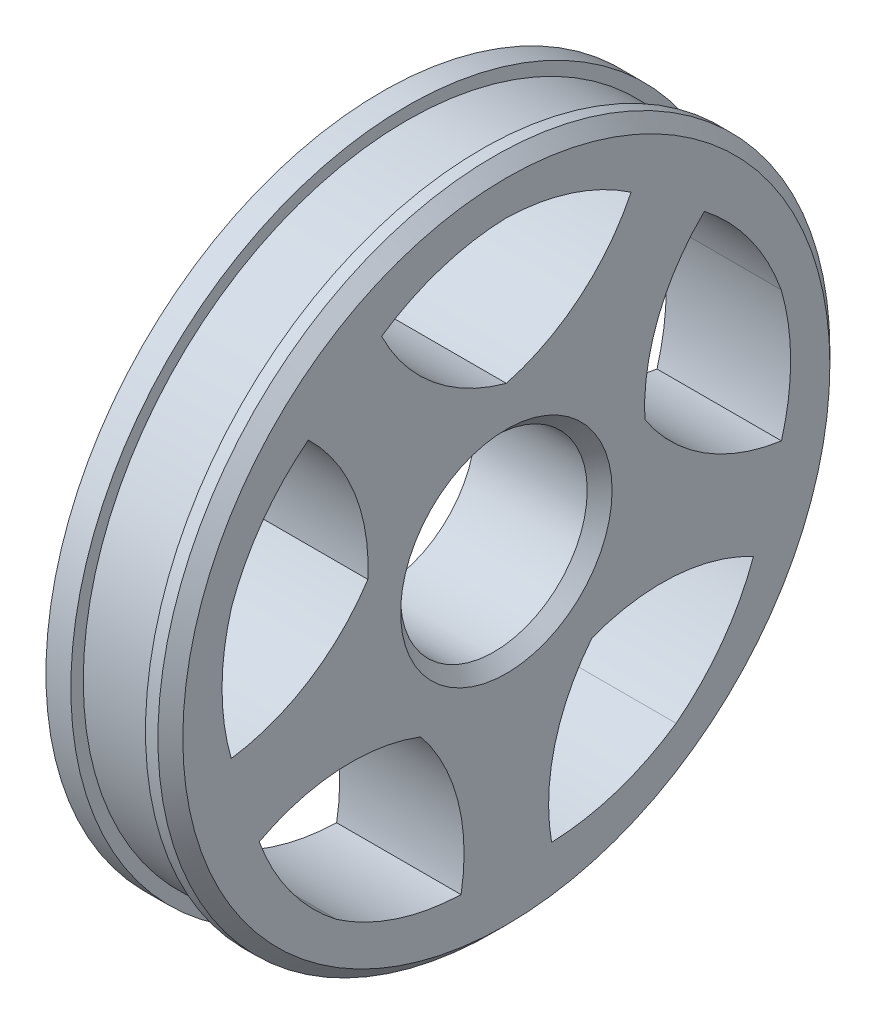
ISO-10303-21;
HEADER;
FILE_DESCRIPTION(('STEP AP214'),'2;1');
FILE_NAME('part.step','',(''),(''),'','','');
FILE_SCHEMA(('AUTOMOTIVE_DESIGN { 1 0 10303 214 1 1 1 1 }'));
ENDSEC;
DATA;
#1=APPLICATION_CONTEXT('core data for automotive mechanical design processes');
#2=APPLICATION_PROTOCOL_DEFINITION('international standard','automotive_design',2000,#1);
#3=PRODUCT_CONTEXT('',#1,'mechanical');
#4=PRODUCT('Part','Part','',(#3));
#5=PRODUCT_RELATED_PRODUCT_CATEGORY('part','',(#4));
#6=PRODUCT_DEFINITION_FORMATION('','',#4);
#7=PRODUCT_DEFINITION_CONTEXT('part definition',#1,'design');
#8=PRODUCT_DEFINITION('design','',#6,#7);
#9=PRODUCT_DEFINITION_SHAPE('','',#8);
#10=(LENGTH_UNIT() NAMED_UNIT(*) SI_UNIT(.MILLI.,.METRE.));
#11=(NAMED_UNIT(*) PLANE_ANGLE_UNIT() SI_UNIT($,.RADIAN.));
#12=(NAMED_UNIT(*) SI_UNIT($,.STERADIAN.) SOLID_ANGLE_UNIT());
#13=UNCERTAINTY_MEASURE_WITH_UNIT(LENGTH_MEASURE(1.E-05),#10,'distance_accuracy_value','');
#14=(GEOMETRIC_REPRESENTATION_CONTEXT(3) GLOBAL_UNCERTAINTY_ASSIGNED_CONTEXT((#13)) GLOBAL_UNIT_ASSIGNED_CONTEXT((#10,
#11,#12)) REPRESENTATION_CONTEXT('',''));
#15=CARTESIAN_POINT('',(0.,0.,0.));
#16=DIRECTION('',(0.,0.,1.));
#17=DIRECTION('',(1.,0.,0.));
#18=AXIS2_PLACEMENT_3D('',#15,#16,#17);
#19=CARTESIAN_POINT('',(2.5,0.,0.));
#20=DIRECTION('',(-1.,0.,0.));
#21=DIRECTION('',(0.,0.,1.));
#22=AXIS2_PLACEMENT_3D('',#19,#20,#21);
#23=CYLINDRICAL_SURFACE('',#22,13.5);
#24=CARTESIAN_POINT('',(-2.5,0.,0.));
#25=DIRECTION('',(1.,0.,0.));
#26=DIRECTION('',(0.,0.,-1.));
#27=AXIS2_PLACEMENT_3D('',#24,#25,#26);
#28=CIRCLE('',#27,13.5);
#29=CARTESIAN_POINT('',(-2.5,0.,-13.5));
#30=VERTEX_POINT('',#29);
#31=EDGE_CURVE('E339',#30,#30,#28,.T.);
#32=ORIENTED_EDGE('',*,*,#31,.T.);
#33=EDGE_LOOP('',(#32));
#34=FACE_BOUND('',#33,.T.);
#35=CARTESIAN_POINT('',(-1.5,0.,0.));
#36=DIRECTION('',(1.,0.,0.));
#37=DIRECTION('',(0.,0.,-1.));
#38=AXIS2_PLACEMENT_3D('',#35,#36,#37);
#39=CIRCLE('',#38,13.5);
#40=CARTESIAN_POINT('',(-1.5,0.,-13.5));
#41=VERTEX_POINT('',#40);
#42=EDGE_CURVE('E253',#41,#41,#39,.T.);
#43=ORIENTED_EDGE('',*,*,#42,.F.);
#44=EDGE_LOOP('',(#43));
#45=FACE_BOUND('',#44,.T.);
#46=ADVANCED_FACE('F35',(#34,#45),#23,.T.);
#47=CARTESIAN_POINT('',(2.5,0.,0.));
#48=DIRECTION('',(1.,0.,0.));
#49=DIRECTION('',(0.,0.,-1.));
#50=AXIS2_PLACEMENT_3D('',#47,#48,#49);
#51=PLANE('',#50);
#52=CARTESIAN_POINT('',(2.5,0.,0.));
#53=DIRECTION('',(1.,0.,0.));
#54=DIRECTION('',(0.,0.,-1.));
#55=AXIS2_PLACEMENT_3D('',#52,#53,#54);
#56=CIRCLE('',#55,4.25);
#57=CARTESIAN_POINT('',(2.5,0.,-4.25));
#58=VERTEX_POINT('',#57);
#59=EDGE_CURVE('E44',#58,#58,#56,.F.);
#60=ORIENTED_EDGE('',*,*,#59,.T.);
#61=EDGE_LOOP('',(#60));
#62=FACE_BOUND('',#61,.T.);
#63=CARTESIAN_POINT('',(2.5,0.,0.));
#64=DIRECTION('',(1.,0.,0.));
#65=DIRECTION('',(0.,0.,-1.));
#66=AXIS2_PLACEMENT_3D('',#63,#64,#65);
#67=CIRCLE('',#66,13.);
#68=CARTESIAN_POINT('',(2.5,0.,-13.));
#69=VERTEX_POINT('',#68);
#70=EDGE_CURVE('E345',#69,#69,#67,.T.);
#71=ORIENTED_EDGE('',*,*,#70,.T.);
#72=EDGE_LOOP('',(#71));
#73=FACE_BOUND('',#72,.T.);
#74=CARTESIAN_POINT('',(2.5,0.931815794103075,-2.02933749414677));
#75=DIRECTION('',(1.,0.,0.));
#76=DIRECTION('',(0.,-0.95105651629515,-0.309016994374958));
#77=AXIS2_PLACEMENT_3D('',#74,#75,#76);
#78=CIRCLE('',#77,9.39432433543306);
#79=CARTESIAN_POINT('',(2.5,-1.678595206542,-11.0536980879518));
#80=VERTEX_POINT('',#79);
#81=CARTESIAN_POINT('',(2.5,3.58728925984448,-11.0405410981085));
#82=VERTEX_POINT('',#81);
#83=EDGE_CURVE('E264',#80,#82,#78,.T.);
#84=ORIENTED_EDGE('',*,*,#83,.F.);
#85=CARTESIAN_POINT('',(2.5,6.08419028301145,-12.1309249973145));
#86=DIRECTION('',(1.,0.,0.));
#87=DIRECTION('',(0.,-0.95105651629515,-0.309016994374958));
#88=AXIS2_PLACEMENT_3D('',#85,#86,#87);
#89=CIRCLE('',#88,7.8371714521935);
#90=CARTESIAN_POINT('',(2.5,1.80765526838161,-5.56339086038598));
#91=VERTEX_POINT('',#90);
#92=EDGE_CURVE('E262',#91,#80,#89,.T.);
#93=ORIENTED_EDGE('',*,*,#92,.F.);
#94=CARTESIAN_POINT('',(2.5,2.2081654741207,-13.3903218008106));
#95=DIRECTION('',(1.,0.,0.));
#96=DIRECTION('',(0.,0.95105651629515,0.309016994374958));
#97=AXIS2_PLACEMENT_3D('',#94,#95,#96);
#98=CIRCLE('',#97,7.8371714521935);
#99=CARTESIAN_POINT('',(2.5,7.85521276816055,-7.95597609686846));
#100=VERTEX_POINT('',#99);
#101=EDGE_CURVE('E268',#100,#91,#98,.T.);
#102=ORIENTED_EDGE('',*,*,#101,.F.);
#103=CARTESIAN_POINT('',(2.5,0.43895983792731,-2.18947610171399));
#104=DIRECTION('',(1.,0.,0.));
#105=DIRECTION('',(0.,0.95105651629515,0.309016994374958));
#106=AXIS2_PLACEMENT_3D('',#103,#104,#105);
#107=CIRCLE('',#106,9.39432433543306);
#108=EDGE_CURVE('E266',#82,#100,#107,.T.);
#109=ORIENTED_EDGE('',*,*,#108,.F.);
#110=EDGE_LOOP('',(#84,#93,#102,#109));
#111=FACE_BOUND('',#110,.T.);
#112=CARTESIAN_POINT('',(2.5,-1.64206773156553,-1.51330925598209));
#113=DIRECTION('',(1.,0.,0.));
#114=DIRECTION('',(0.,-0.58778525229248,0.809016994374942));
#115=AXIS2_PLACEMENT_3D('',#112,#113,#114);
#116=CIRCLE('',#115,9.39432433543306);
#117=CARTESIAN_POINT('',(2.5,-11.0314060412036,-1.81934165046336));
#118=VERTEX_POINT('',#117);
#119=CARTESIAN_POINT('',(2.5,-9.3916452097499,-6.82342965282126));
#120=VERTEX_POINT('',#119);
#121=EDGE_CURVE('E238',#118,#120,#116,.T.);
#122=ORIENTED_EDGE('',*,*,#121,.F.);
#123=CARTESIAN_POINT('',(2.5,-9.65707707292231,-9.53507079669572));
#124=DIRECTION('',(1.,0.,0.));
#125=DIRECTION('',(0.,-0.58778525229248,0.809016994374942));
#126=AXIS2_PLACEMENT_3D('',#123,#124,#125);
#127=CIRCLE('',#126,7.8371714521935);
#128=CARTESIAN_POINT('',(2.5,-4.73250293256568,-3.43836464441911));
#129=VERTEX_POINT('',#128);
#130=EDGE_CURVE('E236',#129,#118,#127,.T.);
#131=ORIENTED_EDGE('',*,*,#130,.F.);
#132=CARTESIAN_POINT('',(2.5,-12.0525921460546,-6.23792715982025));
#133=DIRECTION('',(1.,0.,0.));
#134=DIRECTION('',(0.,0.58778525229248,-0.809016994374942));
#135=AXIS2_PLACEMENT_3D('',#132,#133,#134);
#136=CIRCLE('',#135,7.8371714521935);
#137=CARTESIAN_POINT('',(2.5,-5.13918867062257,-9.92928311081719));
#138=VERTEX_POINT('',#137);
#139=EDGE_CURVE('E242',#138,#129,#136,.T.);
#140=ORIENTED_EDGE('',*,*,#139,.F.);
#141=CARTESIAN_POINT('',(2.5,-1.94666946403999,-1.09406093846006));
#142=DIRECTION('',(1.,0.,0.));
#143=DIRECTION('',(0.,0.58778525229248,-0.809016994374942));
#144=AXIS2_PLACEMENT_3D('',#141,#142,#143);
#145=CIRCLE('',#144,9.39432433543306);
#146=EDGE_CURVE('E240',#120,#138,#145,.T.);
#147=ORIENTED_EDGE('',*,*,#146,.F.);
#148=EDGE_LOOP('',(#122,#131,#140,#147));
#149=FACE_BOUND('',#148,.T.);
#150=CARTESIAN_POINT('',(2.5,-1.94666946404,1.09406093846003));
#151=DIRECTION('',(1.,0.,0.));
#152=DIRECTION('',(0.,0.587785252292469,0.809016994374951));
#153=AXIS2_PLACEMENT_3D('',#150,#151,#152);
#154=CIRCLE('',#153,9.39432433543306);
#155=CARTESIAN_POINT('',(2.5,-5.13918867062272,9.92928311081712));
#156=VERTEX_POINT('',#155);
#157=CARTESIAN_POINT('',(2.5,-9.39164520975,6.82342965282112));
#158=VERTEX_POINT('',#157);
#159=EDGE_CURVE('E211',#156,#158,#154,.T.);
#160=ORIENTED_EDGE('',*,*,#159,.F.);
#161=CARTESIAN_POINT('',(2.5,-12.0525921460547,6.23792715982008));
#162=DIRECTION('',(1.,0.,0.));
#163=DIRECTION('',(0.,0.587785252292469,0.809016994374951));
#164=AXIS2_PLACEMENT_3D('',#161,#162,#163);
#165=CIRCLE('',#164,7.8371714521935);
#166=CARTESIAN_POINT('',(2.5,-4.73250293256573,3.43836464441905));
#167=VERTEX_POINT('',#166);
#168=EDGE_CURVE('E180',#167,#156,#165,.T.);
#169=ORIENTED_EDGE('',*,*,#168,.F.);
#170=CARTESIAN_POINT('',(2.5,-9.65707707292245,9.53507079669558));
#171=DIRECTION('',(1.,0.,0.));
#172=DIRECTION('',(0.,-0.587785252292469,-0.809016994374951));
#173=AXIS2_PLACEMENT_3D('',#170,#171,#172);
#174=CIRCLE('',#173,7.8371714521935);
#175=CARTESIAN_POINT('',(2.5,-11.0314060412037,1.81934165046321));
#176=VERTEX_POINT('',#175);
#177=EDGE_CURVE('E216',#176,#167,#174,.T.);
#178=ORIENTED_EDGE('',*,*,#177,.F.);
#179=CARTESIAN_POINT('',(2.5,-1.64206773156555,1.51330925598207));
#180=DIRECTION('',(1.,0.,0.));
#181=DIRECTION('',(0.,-0.587785252292469,-0.809016994374951));
#182=AXIS2_PLACEMENT_3D('',#179,#180,#181);
#183=CIRCLE('',#182,9.39432433543306);
#184=EDGE_CURVE('E213',#158,#176,#183,.T.);
#185=ORIENTED_EDGE('',*,*,#184,.F.);
#186=EDGE_LOOP('',(#160,#169,#178,#185));
#187=FACE_BOUND('',#186,.T.);
#188=CARTESIAN_POINT('',(2.5,0.438959837927279,2.18947610171399));
#189=DIRECTION('',(1.,0.,0.));
#190=DIRECTION('',(0.,0.951056516295155,-0.309016994374945));
#191=AXIS2_PLACEMENT_3D('',#188,#189,#190);
#192=CIRCLE('',#191,9.39432433543306);
#193=CARTESIAN_POINT('',(2.5,7.85521276816044,7.95597609686858));
#194=VERTEX_POINT('',#193);
#195=CARTESIAN_POINT('',(2.5,3.58728925984432,11.0405410981086));
#196=VERTEX_POINT('',#195);
#197=EDGE_CURVE('E290',#194,#196,#192,.T.);
#198=ORIENTED_EDGE('',*,*,#197,.F.);
#199=CARTESIAN_POINT('',(2.5,2.20816547412051,13.3903218008106));
#200=DIRECTION('',(1.,0.,0.));
#201=DIRECTION('',(0.,0.951056516295155,-0.309016994374945));
#202=AXIS2_PLACEMENT_3D('',#199,#200,#201);
#203=CIRCLE('',#202,7.8371714521935);
#204=CARTESIAN_POINT('',(2.5,1.80765526838153,5.56339086038601));
#205=VERTEX_POINT('',#204);
#206=EDGE_CURVE('E288',#205,#194,#203,.T.);
#207=ORIENTED_EDGE('',*,*,#206,.F.);
#208=CARTESIAN_POINT('',(2.5,6.08419028301128,12.1309249973146));
#209=DIRECTION('',(1.,0.,0.));
#210=DIRECTION('',(0.,-0.951056516295155,0.309016994374945));
#211=AXIS2_PLACEMENT_3D('',#208,#209,#210);
#212=CIRCLE('',#211,7.8371714521935);
#213=CARTESIAN_POINT('',(2.5,-1.67859520654215,11.0536980879518));
#214=VERTEX_POINT('',#213);
#215=EDGE_CURVE('E295',#214,#205,#212,.T.);
#216=ORIENTED_EDGE('',*,*,#215,.F.);
#217=CARTESIAN_POINT('',(2.5,0.931815794103047,2.02933749414678));
#218=DIRECTION('',(1.,0.,0.));
#219=DIRECTION('',(0.,-0.951056516295155,0.309016994374945));
#220=AXIS2_PLACEMENT_3D('',#217,#218,#219);
#221=CIRCLE('',#220,9.39432433543306);
#222=EDGE_CURVE('E292',#196,#214,#221,.T.);
#223=ORIENTED_EDGE('',*,*,#222,.F.);
#224=EDGE_LOOP('',(#198,#207,#216,#223));
#225=FACE_BOUND('',#224,.T.);
#226=CARTESIAN_POINT('',(2.5,2.21796156357521,0.259109709954825));
#227=DIRECTION('',(1.,0.,0.));
#228=DIRECTION('',(0.,0.,-1.));
#229=AXIS2_PLACEMENT_3D('',#226,#227,#228);
#230=CIRCLE('',#229,9.39432433543306);
#231=CARTESIAN_POINT('',(2.5,9.99397715020798,-5.01221946927066));
#232=VERTEX_POINT('',#231);
#233=CARTESIAN_POINT('',(2.5,11.6087118998112,0.));
#234=VERTEX_POINT('',#233);
#235=EDGE_CURVE('E320',#232,#234,#230,.T.);
#236=ORIENTED_EDGE('',*,*,#235,.F.);
#237=CARTESIAN_POINT('',(2.5,13.4173134618452,2.03774683337949));
#238=DIRECTION('',(1.,0.,0.));
#239=DIRECTION('',(0.,0.,-1.));
#240=AXIS2_PLACEMENT_3D('',#237,#238,#239);
#241=CIRCLE('',#240,7.8371714521935);
#242=CARTESIAN_POINT('',(2.5,5.84969532836832,0.));
#243=VERTEX_POINT('',#242);
#244=EDGE_CURVE('E318',#243,#232,#241,.T.);
#245=ORIENTED_EDGE('',*,*,#244,.F.);
#246=CARTESIAN_POINT('',(2.5,13.4173134618452,-2.03774683337949));
#247=DIRECTION('',(1.,0.,0.));
#248=DIRECTION('',(0.,0.,1.));
#249=AXIS2_PLACEMENT_3D('',#246,#247,#248);
#250=CIRCLE('',#249,7.8371714521935);
#251=CARTESIAN_POINT('',(2.5,9.99397715020798,5.01221946927066));
#252=VERTEX_POINT('',#251);
#253=EDGE_CURVE('E325',#252,#243,#250,.T.);
#254=ORIENTED_EDGE('',*,*,#253,.F.);
#255=CARTESIAN_POINT('',(2.5,2.21796156357521,-0.259109709954825));
#256=DIRECTION('',(1.,0.,0.));
#257=DIRECTION('',(0.,0.,1.));
#258=AXIS2_PLACEMENT_3D('',#255,#256,#257);
#259=CIRCLE('',#258,9.39432433543306);
#260=EDGE_CURVE('E322',#234,#252,#259,.T.);
#261=ORIENTED_EDGE('',*,*,#260,.F.);
#262=EDGE_LOOP('',(#236,#245,#254,#261));
#263=FACE_BOUND('',#262,.T.);
#264=ADVANCED_FACE('F350',(#62,#73,#111,#149,#187,#225,#263),#51,.T.);
#265=CARTESIAN_POINT('',(-2.5,0.,0.));
#266=DIRECTION('',(1.,0.,0.));
#267=DIRECTION('',(0.,0.,-1.));
#268=AXIS2_PLACEMENT_3D('',#265,#266,#267);
#269=PLANE('',#268);
#270=CARTESIAN_POINT('',(-2.5,6.08419028301145,-12.1309249973145));
#271=DIRECTION('',(1.,0.,0.));
#272=DIRECTION('',(0.,-0.95105651629515,-0.309016994374958));
#273=AXIS2_PLACEMENT_3D('',#270,#271,#272);
#274=CIRCLE('',#273,7.8371714521935);
#275=CARTESIAN_POINT('',(-2.5,1.80765526838161,-5.56339086038598));
#276=VERTEX_POINT('',#275);
#277=CARTESIAN_POINT('',(-2.5,-1.678595206542,-11.0536980879518));
#278=VERTEX_POINT('',#277);
#279=EDGE_CURVE('E249',#276,#278,#274,.T.);
#280=ORIENTED_EDGE('',*,*,#279,.T.);
#281=CARTESIAN_POINT('',(-2.5,0.931815794103075,-2.02933749414677));
#282=DIRECTION('',(1.,0.,0.));
#283=DIRECTION('',(0.,-0.95105651629515,-0.309016994374958));
#284=AXIS2_PLACEMENT_3D('',#281,#282,#283);
#285=CIRCLE('',#284,9.39432433543306);
#286=CARTESIAN_POINT('',(-2.5,3.58728925984448,-11.0405410981085));
#287=VERTEX_POINT('',#286);
#288=EDGE_CURVE('E252',#278,#287,#285,.T.);
#289=ORIENTED_EDGE('',*,*,#288,.T.);
#290=CARTESIAN_POINT('',(-2.5,0.43895983792731,-2.18947610171399));
#291=DIRECTION('',(1.,0.,0.));
#292=DIRECTION('',(0.,0.95105651629515,0.309016994374958));
#293=AXIS2_PLACEMENT_3D('',#290,#291,#292);
#294=CIRCLE('',#293,9.39432433543306);
#295=CARTESIAN_POINT('',(-2.5,7.85521276816055,-7.95597609686846));
#296=VERTEX_POINT('',#295);
#297=EDGE_CURVE('E256',#287,#296,#294,.T.);
#298=ORIENTED_EDGE('',*,*,#297,.T.);
#299=CARTESIAN_POINT('',(-2.5,2.2081654741207,-13.3903218008106));
#300=DIRECTION('',(1.,0.,0.));
#301=DIRECTION('',(0.,0.95105651629515,0.309016994374958));
#302=AXIS2_PLACEMENT_3D('',#299,#300,#301);
#303=CIRCLE('',#302,7.8371714521935);
#304=EDGE_CURVE('E259',#296,#276,#303,.T.);
#305=ORIENTED_EDGE('',*,*,#304,.T.);
#306=EDGE_LOOP('',(#280,#289,#298,#305));
#307=FACE_BOUND('',#306,.T.);
#308=CARTESIAN_POINT('',(-2.5,-9.65707707292231,-9.53507079669572));
#309=DIRECTION('',(1.,0.,0.));
#310=DIRECTION('',(0.,-0.58778525229248,0.809016994374942));
#311=AXIS2_PLACEMENT_3D('',#308,#309,#310);
#312=CIRCLE('',#311,7.8371714521935);
#313=CARTESIAN_POINT('',(-2.5,-4.73250293256567,-3.43836464441911));
#314=VERTEX_POINT('',#313);
#315=CARTESIAN_POINT('',(-2.5,-11.0314060412036,-1.81934165046336));
#316=VERTEX_POINT('',#315);
#317=EDGE_CURVE('E223',#314,#316,#312,.T.);
#318=ORIENTED_EDGE('',*,*,#317,.T.);
#319=CARTESIAN_POINT('',(-2.5,-1.64206773156553,-1.51330925598209));
#320=DIRECTION('',(1.,0.,0.));
#321=DIRECTION('',(0.,-0.58778525229248,0.809016994374942));
#322=AXIS2_PLACEMENT_3D('',#319,#320,#321);
#323=CIRCLE('',#322,9.39432433543306);
#324=CARTESIAN_POINT('',(-2.5,-9.3916452097499,-6.82342965282126));
#325=VERTEX_POINT('',#324);
#326=EDGE_CURVE('E226',#316,#325,#323,.T.);
#327=ORIENTED_EDGE('',*,*,#326,.T.);
#328=CARTESIAN_POINT('',(-2.5,-1.94666946403999,-1.09406093846006));
#329=DIRECTION('',(1.,0.,0.));
#330=DIRECTION('',(0.,0.58778525229248,-0.809016994374942));
#331=AXIS2_PLACEMENT_3D('',#328,#329,#330);
#332=CIRCLE('',#331,9.39432433543306);
#333=CARTESIAN_POINT('',(-2.5,-5.13918867062257,-9.92928311081719));
#334=VERTEX_POINT('',#333);
#335=EDGE_CURVE('E230',#325,#334,#332,.T.);
#336=ORIENTED_EDGE('',*,*,#335,.T.);
#337=CARTESIAN_POINT('',(-2.5,-12.0525921460546,-6.23792715982025));
#338=DIRECTION('',(1.,0.,0.));
#339=DIRECTION('',(0.,0.58778525229248,-0.809016994374942));
#340=AXIS2_PLACEMENT_3D('',#337,#338,#339);
#341=CIRCLE('',#340,7.8371714521935);
#342=EDGE_CURVE('E233',#334,#314,#341,.T.);
#343=ORIENTED_EDGE('',*,*,#342,.T.);
#344=EDGE_LOOP('',(#318,#327,#336,#343));
#345=FACE_BOUND('',#344,.T.);
#346=CARTESIAN_POINT('',(-2.5,-12.0525921460547,6.23792715982008));
#347=DIRECTION('',(1.,0.,0.));
#348=DIRECTION('',(0.,0.587785252292469,0.809016994374951));
#349=AXIS2_PLACEMENT_3D('',#346,#347,#348);
#350=CIRCLE('',#349,7.8371714521935);
#351=CARTESIAN_POINT('',(-2.5,-4.73250293256573,3.43836464441905));
#352=VERTEX_POINT('',#351);
#353=CARTESIAN_POINT('',(-2.5,-5.13918867062272,9.92928311081712));
#354=VERTEX_POINT('',#353);
#355=EDGE_CURVE('E177',#352,#354,#350,.T.);
#356=ORIENTED_EDGE('',*,*,#355,.T.);
#357=CARTESIAN_POINT('',(-2.5,-1.94666946404,1.09406093846003));
#358=DIRECTION('',(1.,0.,0.));
#359=DIRECTION('',(0.,0.587785252292469,0.809016994374951));
#360=AXIS2_PLACEMENT_3D('',#357,#358,#359);
#361=CIRCLE('',#360,9.39432433543306);
#362=CARTESIAN_POINT('',(-2.5,-9.39164520975,6.82342965282112));
#363=VERTEX_POINT('',#362);
#364=EDGE_CURVE('E187',#354,#363,#361,.T.);
#365=ORIENTED_EDGE('',*,*,#364,.T.);
#366=CARTESIAN_POINT('',(-2.5,-1.64206773156555,1.51330925598207));
#367=DIRECTION('',(1.,0.,0.));
#368=DIRECTION('',(0.,-0.587785252292469,-0.809016994374951));
#369=AXIS2_PLACEMENT_3D('',#366,#367,#368);
#370=CIRCLE('',#369,9.39432433543306);
#371=CARTESIAN_POINT('',(-2.5,-11.0314060412037,1.8193416504632));
#372=VERTEX_POINT('',#371);
#373=EDGE_CURVE('E193',#363,#372,#370,.T.);
#374=ORIENTED_EDGE('',*,*,#373,.T.);
#375=CARTESIAN_POINT('',(-2.5,-9.65707707292245,9.53507079669558));
#376=DIRECTION('',(1.,0.,0.));
#377=DIRECTION('',(0.,-0.587785252292469,-0.809016994374951));
#378=AXIS2_PLACEMENT_3D('',#375,#376,#377);
#379=CIRCLE('',#378,7.8371714521935);
#380=EDGE_CURVE('E199',#372,#352,#379,.T.);
#381=ORIENTED_EDGE('',*,*,#380,.T.);
#382=EDGE_LOOP('',(#356,#365,#374,#381));
#383=FACE_BOUND('',#382,.T.);
#384=CARTESIAN_POINT('',(-2.5,2.20816547412051,13.3903218008106));
#385=DIRECTION('',(1.,0.,0.));
#386=DIRECTION('',(0.,0.951056516295155,-0.309016994374945));
#387=AXIS2_PLACEMENT_3D('',#384,#385,#386);
#388=CIRCLE('',#387,7.8371714521935);
#389=CARTESIAN_POINT('',(-2.5,1.80765526838153,5.56339086038601));
#390=VERTEX_POINT('',#389);
#391=CARTESIAN_POINT('',(-2.5,7.85521276816044,7.95597609686858));
#392=VERTEX_POINT('',#391);
#393=EDGE_CURVE('E183',#390,#392,#388,.T.);
#394=ORIENTED_EDGE('',*,*,#393,.T.);
#395=CARTESIAN_POINT('',(-2.5,0.438959837927279,2.18947610171399));
#396=DIRECTION('',(1.,0.,0.));
#397=DIRECTION('',(0.,0.951056516295155,-0.309016994374945));
#398=AXIS2_PLACEMENT_3D('',#395,#396,#397);
#399=CIRCLE('',#398,9.39432433543306);
#400=CARTESIAN_POINT('',(-2.5,3.58728925984432,11.0405410981086));
#401=VERTEX_POINT('',#400);
#402=EDGE_CURVE('E279',#392,#401,#399,.T.);
#403=ORIENTED_EDGE('',*,*,#402,.T.);
#404=CARTESIAN_POINT('',(-2.5,0.931815794103047,2.02933749414678));
#405=DIRECTION('',(1.,0.,0.));
#406=DIRECTION('',(0.,-0.951056516295155,0.309016994374945));
#407=AXIS2_PLACEMENT_3D('',#404,#405,#406);
#408=CIRCLE('',#407,9.39432433543306);
#409=CARTESIAN_POINT('',(-2.5,-1.67859520654215,11.0536980879518));
#410=VERTEX_POINT('',#409);
#411=EDGE_CURVE('E282',#401,#410,#408,.T.);
#412=ORIENTED_EDGE('',*,*,#411,.T.);
#413=CARTESIAN_POINT('',(-2.5,6.08419028301128,12.1309249973146));
#414=DIRECTION('',(1.,0.,0.));
#415=DIRECTION('',(0.,-0.951056516295155,0.309016994374945));
#416=AXIS2_PLACEMENT_3D('',#413,#414,#415);
#417=CIRCLE('',#416,7.8371714521935);
#418=EDGE_CURVE('E285',#410,#390,#417,.T.);
#419=ORIENTED_EDGE('',*,*,#418,.T.);
#420=EDGE_LOOP('',(#394,#403,#412,#419));
#421=FACE_BOUND('',#420,.T.);
#422=CARTESIAN_POINT('',(-2.5,13.4173134618452,2.03774683337949));
#423=DIRECTION('',(1.,0.,0.));
#424=DIRECTION('',(0.,0.,-1.));
#425=AXIS2_PLACEMENT_3D('',#422,#423,#424);
#426=CIRCLE('',#425,7.8371714521935);
#427=CARTESIAN_POINT('',(-2.5,5.84969532836832,0.));
#428=VERTEX_POINT('',#427);
#429=CARTESIAN_POINT('',(-2.5,9.99397715020798,-5.01221946927066));
#430=VERTEX_POINT('',#429);
#431=EDGE_CURVE('E306',#428,#430,#426,.T.);
#432=ORIENTED_EDGE('',*,*,#431,.T.);
#433=CARTESIAN_POINT('',(-2.5,2.21796156357521,0.259109709954825));
#434=DIRECTION('',(1.,0.,0.));
#435=DIRECTION('',(0.,0.,-1.));
#436=AXIS2_PLACEMENT_3D('',#433,#434,#435);
#437=CIRCLE('',#436,9.39432433543306);
#438=CARTESIAN_POINT('',(-2.5,11.6087118998112,0.));
#439=VERTEX_POINT('',#438);
#440=EDGE_CURVE('E309',#430,#439,#437,.T.);
#441=ORIENTED_EDGE('',*,*,#440,.T.);
#442=CARTESIAN_POINT('',(-2.5,2.21796156357521,-0.259109709954825));
#443=DIRECTION('',(1.,0.,0.));
#444=DIRECTION('',(0.,0.,1.));
#445=AXIS2_PLACEMENT_3D('',#442,#443,#444);
#446=CIRCLE('',#445,9.39432433543306);
#447=CARTESIAN_POINT('',(-2.5,9.99397715020798,5.01221946927066));
#448=VERTEX_POINT('',#447);
#449=EDGE_CURVE('E312',#439,#448,#446,.T.);
#450=ORIENTED_EDGE('',*,*,#449,.T.);
#451=CARTESIAN_POINT('',(-2.5,13.4173134618452,-2.03774683337949));
#452=DIRECTION('',(1.,0.,0.));
#453=DIRECTION('',(0.,0.,1.));
#454=AXIS2_PLACEMENT_3D('',#451,#452,#453);
#455=CIRCLE('',#454,7.8371714521935);
#456=EDGE_CURVE('E315',#448,#428,#455,.T.);
#457=ORIENTED_EDGE('',*,*,#456,.T.);
#458=EDGE_LOOP('',(#432,#441,#450,#457));
#459=FACE_BOUND('',#458,.T.);
#460=ORIENTED_EDGE('',*,*,#31,.F.);
#461=EDGE_LOOP('',(#460));
#462=FACE_BOUND('',#461,.T.);
#463=CARTESIAN_POINT('',(-2.5,0.,0.));
#464=DIRECTION('',(1.,0.,0.));
#465=DIRECTION('',(0.,0.,-1.));
#466=AXIS2_PLACEMENT_3D('',#463,#464,#465);
#467=CIRCLE('',#466,3.75);
#468=CARTESIAN_POINT('',(-2.5,0.,-3.75));
#469=VERTEX_POINT('',#468);
#470=EDGE_CURVE('E336',#469,#469,#467,.T.);
#471=ORIENTED_EDGE('',*,*,#470,.T.);
#472=EDGE_LOOP('',(#471));
#473=FACE_BOUND('',#472,.T.);
#474=ADVANCED_FACE('F196',(#307,#345,#383,#421,#459,#462,#473),#269,.F.);
#475=CARTESIAN_POINT('',(1.5,0.,0.));
#476=DIRECTION('',(1.,0.,0.));
#477=DIRECTION('',(0.,0.,-1.));
#478=AXIS2_PLACEMENT_3D('',#475,#476,#477);
#479=CIRCLE('',#478,13.5);
#480=CARTESIAN_POINT('',(1.5,0.,-13.5));
#481=VERTEX_POINT('',#480);
#482=EDGE_CURVE('E205',#481,#481,#479,.T.);
#483=ORIENTED_EDGE('',*,*,#482,.T.);
#484=EDGE_LOOP('',(#483));
#485=FACE_BOUND('',#484,.T.);
#486=CARTESIAN_POINT('',(2.,0.,0.));
#487=DIRECTION('',(1.,0.,0.));
#488=DIRECTION('',(0.,0.,-1.));
#489=AXIS2_PLACEMENT_3D('',#486,#487,#488);
#490=CIRCLE('',#489,13.5);
#491=CARTESIAN_POINT('',(2.,0.,-13.5));
#492=VERTEX_POINT('',#491);
#493=EDGE_CURVE('E11',#492,#492,#490,.F.);
#494=ORIENTED_EDGE('',*,*,#493,.T.);
#495=EDGE_LOOP('',(#494));
#496=FACE_BOUND('',#495,.T.);
#497=ADVANCED_FACE('F363',(#485,#496),#23,.T.);
#498=CARTESIAN_POINT('',(2.5,0.,0.));
#499=DIRECTION('',(-1.,0.,0.));
#500=DIRECTION('',(0.,0.,1.));
#501=AXIS2_PLACEMENT_3D('',#498,#499,#500);
#502=CYLINDRICAL_SURFACE('',#501,3.75);
#503=CARTESIAN_POINT('',(2.00000000000001,0.,0.));
#504=DIRECTION('',(1.,0.,0.));
#505=DIRECTION('',(0.,0.,-1.));
#506=AXIS2_PLACEMENT_3D('',#503,#504,#505);
#507=CIRCLE('',#506,3.75);
#508=CARTESIAN_POINT('',(2.00000000000001,0.,-3.75));
#509=VERTEX_POINT('',#508);
#510=EDGE_CURVE('E342',#509,#509,#507,.T.);
#511=ORIENTED_EDGE('',*,*,#510,.T.);
#512=EDGE_LOOP('',(#511));
#513=FACE_BOUND('',#512,.T.);
#514=ORIENTED_EDGE('',*,*,#470,.F.);
#515=EDGE_LOOP('',(#514));
#516=FACE_BOUND('',#515,.T.);
#517=ADVANCED_FACE('F359',(#513,#516),#502,.F.);
#518=CARTESIAN_POINT('',(2.5,13.4173134618452,2.03774683337949));
#519=DIRECTION('',(-1.,0.,0.));
#520=DIRECTION('',(0.,0.,1.));
#521=AXIS2_PLACEMENT_3D('',#518,#519,#520);
#522=CYLINDRICAL_SURFACE('',#521,7.8371714521935);
#523=DIRECTION('',(-1.,0.,0.));
#524=VECTOR('',#523,1.);
#525=CARTESIAN_POINT('',(2.5,5.84969532836832,0.));
#526=LINE('',#525,#524);
#527=EDGE_CURVE('E327',#243,#428,#526,.T.);
#528=ORIENTED_EDGE('',*,*,#527,.F.);
#529=ORIENTED_EDGE('',*,*,#244,.T.);
#530=DIRECTION('',(-1.,0.,0.));
#531=VECTOR('',#530,1.);
#532=CARTESIAN_POINT('',(2.5,9.99397715020798,-5.01221946927066));
#533=LINE('',#532,#531);
#534=EDGE_CURVE('E334',#232,#430,#533,.T.);
#535=ORIENTED_EDGE('',*,*,#534,.T.);
#536=ORIENTED_EDGE('',*,*,#431,.F.);
#537=EDGE_LOOP('',(#528,#529,#535,#536));
#538=FACE_BOUND('',#537,.T.);
#539=ADVANCED_FACE('F362',(#538),#522,.F.);
#540=CARTESIAN_POINT('',(2.5,2.21796156357521,0.259109709954825));
#541=DIRECTION('',(-1.,0.,0.));
#542=DIRECTION('',(0.,0.,1.));
#543=AXIS2_PLACEMENT_3D('',#540,#541,#542);
#544=CYLINDRICAL_SURFACE('',#543,9.39432433543306);
#545=ORIENTED_EDGE('',*,*,#534,.F.);
#546=ORIENTED_EDGE('',*,*,#235,.T.);
#547=DIRECTION('',(-1.,0.,0.));
#548=VECTOR('',#547,1.);
#549=CARTESIAN_POINT('',(2.5,11.6087118998112,0.));
#550=LINE('',#549,#548);
#551=EDGE_CURVE('E332',#234,#439,#550,.T.);
#552=ORIENTED_EDGE('',*,*,#551,.T.);
#553=ORIENTED_EDGE('',*,*,#440,.F.);
#554=EDGE_LOOP('',(#545,#546,#552,#553));
#555=FACE_BOUND('',#554,.T.);
#556=ADVANCED_FACE('F481',(#555),#544,.F.);
#557=CARTESIAN_POINT('',(2.5,2.21796156357521,-0.259109709954825));
#558=DIRECTION('',(-1.,0.,0.));
#559=DIRECTION('',(0.,0.,1.));
#560=AXIS2_PLACEMENT_3D('',#557,#558,#559);
#561=CYLINDRICAL_SURFACE('',#560,9.39432433543306);
#562=ORIENTED_EDGE('',*,*,#551,.F.);
#563=ORIENTED_EDGE('',*,*,#260,.T.);
#564=DIRECTION('',(-1.,0.,0.));
#565=VECTOR('',#564,1.);
#566=CARTESIAN_POINT('',(2.5,9.99397715020798,5.01221946927066));
#567=LINE('',#566,#565);
#568=EDGE_CURVE('E330',#252,#448,#567,.T.);
#569=ORIENTED_EDGE('',*,*,#568,.T.);
#570=ORIENTED_EDGE('',*,*,#449,.F.);
#571=EDGE_LOOP('',(#562,#563,#569,#570));
#572=FACE_BOUND('',#571,.T.);
#573=ADVANCED_FACE('F477',(#572),#561,.F.);
#574=CARTESIAN_POINT('',(2.5,13.4173134618452,-2.03774683337949));
#575=DIRECTION('',(-1.,0.,0.));
#576=DIRECTION('',(0.,0.,1.));
#577=AXIS2_PLACEMENT_3D('',#574,#575,#576);
#578=CYLINDRICAL_SURFACE('',#577,7.8371714521935);
#579=ORIENTED_EDGE('',*,*,#568,.F.);
#580=ORIENTED_EDGE('',*,*,#253,.T.);
#581=ORIENTED_EDGE('',*,*,#527,.T.);
#582=ORIENTED_EDGE('',*,*,#456,.F.);
#583=EDGE_LOOP('',(#579,#580,#581,#582));
#584=FACE_BOUND('',#583,.T.);
#585=ADVANCED_FACE('F473',(#584),#578,.F.);
#586=CARTESIAN_POINT('',(2.5,2.20816547412051,13.3903218008106));
#587=DIRECTION('',(-1.,0.,0.));
#588=DIRECTION('',(0.,0.,1.));
#589=AXIS2_PLACEMENT_3D('',#586,#587,#588);
#590=CYLINDRICAL_SURFACE('',#589,7.8371714521935);
#591=DIRECTION('',(-1.,0.,0.));
#592=VECTOR('',#591,1.);
#593=CARTESIAN_POINT('',(2.5,1.80765526838153,5.56339086038601));
#594=LINE('',#593,#592);
#595=EDGE_CURVE('E297',#205,#390,#594,.T.);
#596=ORIENTED_EDGE('',*,*,#595,.F.);
#597=ORIENTED_EDGE('',*,*,#206,.T.);
#598=DIRECTION('',(-1.,0.,0.));
#599=VECTOR('',#598,1.);
#600=CARTESIAN_POINT('',(2.5,7.85521276816044,7.95597609686858));
#601=LINE('',#600,#599);
#602=EDGE_CURVE('E304',#194,#392,#601,.T.);
#603=ORIENTED_EDGE('',*,*,#602,.T.);
#604=ORIENTED_EDGE('',*,*,#393,.F.);
#605=EDGE_LOOP('',(#596,#597,#603,#604));
#606=FACE_BOUND('',#605,.T.);
#607=ADVANCED_FACE('F469',(#606),#590,.F.);
#608=CARTESIAN_POINT('',(2.5,0.438959837927279,2.18947610171399));
#609=DIRECTION('',(-1.,0.,0.));
#610=DIRECTION('',(0.,0.,1.));
#611=AXIS2_PLACEMENT_3D('',#608,#609,#610);
#612=CYLINDRICAL_SURFACE('',#611,9.39432433543306);
#613=ORIENTED_EDGE('',*,*,#602,.F.);
#614=ORIENTED_EDGE('',*,*,#197,.T.);
#615=DIRECTION('',(-1.,0.,0.));
#616=VECTOR('',#615,1.);
#617=CARTESIAN_POINT('',(2.5,3.58728925984432,11.0405410981086));
#618=LINE('',#617,#616);
#619=EDGE_CURVE('E302',#196,#401,#618,.T.);
#620=ORIENTED_EDGE('',*,*,#619,.T.);
#621=ORIENTED_EDGE('',*,*,#402,.F.);
#622=EDGE_LOOP('',(#613,#614,#620,#621));
#623=FACE_BOUND('',#622,.T.);
#624=ADVANCED_FACE('F465',(#623),#612,.F.);
#625=CARTESIAN_POINT('',(2.5,0.931815794103047,2.02933749414678));
#626=DIRECTION('',(-1.,0.,0.));
#627=DIRECTION('',(0.,0.,1.));
#628=AXIS2_PLACEMENT_3D('',#625,#626,#627);
#629=CYLINDRICAL_SURFACE('',#628,9.39432433543306);
#630=ORIENTED_EDGE('',*,*,#619,.F.);
#631=ORIENTED_EDGE('',*,*,#222,.T.);
#632=DIRECTION('',(-1.,0.,0.));
#633=VECTOR('',#632,1.);
#634=CARTESIAN_POINT('',(2.5,-1.67859520654215,11.0536980879518));
#635=LINE('',#634,#633);
#636=EDGE_CURVE('E300',#214,#410,#635,.T.);
#637=ORIENTED_EDGE('',*,*,#636,.T.);
#638=ORIENTED_EDGE('',*,*,#411,.F.);
#639=EDGE_LOOP('',(#630,#631,#637,#638));
#640=FACE_BOUND('',#639,.T.);
#641=ADVANCED_FACE('F461',(#640),#629,.F.);
#642=CARTESIAN_POINT('',(2.5,6.08419028301128,12.1309249973146));
#643=DIRECTION('',(-1.,0.,0.));
#644=DIRECTION('',(0.,0.,1.));
#645=AXIS2_PLACEMENT_3D('',#642,#643,#644);
#646=CYLINDRICAL_SURFACE('',#645,7.8371714521935);
#647=ORIENTED_EDGE('',*,*,#636,.F.);
#648=ORIENTED_EDGE('',*,*,#215,.T.);
#649=ORIENTED_EDGE('',*,*,#595,.T.);
#650=ORIENTED_EDGE('',*,*,#418,.F.);
#651=EDGE_LOOP('',(#647,#648,#649,#650));
#652=FACE_BOUND('',#651,.T.);
#653=ADVANCED_FACE('F430',(#652),#646,.F.);
#654=CARTESIAN_POINT('',(2.5,-12.0525921460547,6.23792715982008));
#655=DIRECTION('',(-1.,0.,0.));
#656=DIRECTION('',(0.,0.,1.));
#657=AXIS2_PLACEMENT_3D('',#654,#655,#656);
#658=CYLINDRICAL_SURFACE('',#657,7.8371714521935);
#659=DIRECTION('',(-1.,0.,0.));
#660=VECTOR('',#659,1.);
#661=CARTESIAN_POINT('',(2.5,-4.73250293256573,3.43836464441905));
#662=LINE('',#661,#660);
#663=EDGE_CURVE('E218',#167,#352,#662,.T.);
#664=ORIENTED_EDGE('',*,*,#663,.F.);
#665=ORIENTED_EDGE('',*,*,#168,.T.);
#666=DIRECTION('',(-1.,0.,0.));
#667=VECTOR('',#666,1.);
#668=CARTESIAN_POINT('',(2.5,-5.13918867062272,9.92928311081712));
#669=LINE('',#668,#667);
#670=EDGE_CURVE('E172',#156,#354,#669,.T.);
#671=ORIENTED_EDGE('',*,*,#670,.T.);
#672=ORIENTED_EDGE('',*,*,#355,.F.);
#673=EDGE_LOOP('',(#664,#665,#671,#672));
#674=FACE_BOUND('',#673,.T.);
#675=ADVANCED_FACE('F175',(#674),#658,.F.);
#676=CARTESIAN_POINT('',(2.5,-1.94666946404,1.09406093846003));
#677=DIRECTION('',(-1.,0.,0.));
#678=DIRECTION('',(0.,0.,1.));
#679=AXIS2_PLACEMENT_3D('',#676,#677,#678);
#680=CYLINDRICAL_SURFACE('',#679,9.39432433543306);
#681=ORIENTED_EDGE('',*,*,#670,.F.);
#682=ORIENTED_EDGE('',*,*,#159,.T.);
#683=DIRECTION('',(-1.,0.,0.));
#684=VECTOR('',#683,1.);
#685=CARTESIAN_POINT('',(2.5,-9.39164520975,6.82342965282112));
#686=LINE('',#685,#684);
#687=EDGE_CURVE('E184',#158,#363,#686,.T.);
#688=ORIENTED_EDGE('',*,*,#687,.T.);
#689=ORIENTED_EDGE('',*,*,#364,.F.);
#690=EDGE_LOOP('',(#681,#682,#688,#689));
#691=FACE_BOUND('',#690,.T.);
#692=ADVANCED_FACE('F188',(#691),#680,.F.);
#693=CARTESIAN_POINT('',(2.5,-1.64206773156555,1.51330925598207));
#694=DIRECTION('',(-1.,0.,0.));
#695=DIRECTION('',(0.,0.,1.));
#696=AXIS2_PLACEMENT_3D('',#693,#694,#695);
#697=CYLINDRICAL_SURFACE('',#696,9.39432433543306);
#698=ORIENTED_EDGE('',*,*,#687,.F.);
#699=ORIENTED_EDGE('',*,*,#184,.T.);
#700=DIRECTION('',(-1.,0.,0.));
#701=VECTOR('',#700,1.);
#702=CARTESIAN_POINT('',(2.5,-11.0314060412037,1.8193416504632));
#703=LINE('',#702,#701);
#704=EDGE_CURVE('E220',#176,#372,#703,.T.);
#705=ORIENTED_EDGE('',*,*,#704,.T.);
#706=ORIENTED_EDGE('',*,*,#373,.F.);
#707=EDGE_LOOP('',(#698,#699,#705,#706));
#708=FACE_BOUND('',#707,.T.);
#709=ADVANCED_FACE('F421',(#708),#697,.F.);
#710=CARTESIAN_POINT('',(2.5,-9.65707707292245,9.53507079669558));
#711=DIRECTION('',(-1.,0.,0.));
#712=DIRECTION('',(0.,0.,1.));
#713=AXIS2_PLACEMENT_3D('',#710,#711,#712);
#714=CYLINDRICAL_SURFACE('',#713,7.8371714521935);
#715=ORIENTED_EDGE('',*,*,#704,.F.);
#716=ORIENTED_EDGE('',*,*,#177,.T.);
#717=ORIENTED_EDGE('',*,*,#663,.T.);
#718=ORIENTED_EDGE('',*,*,#380,.F.);
#719=EDGE_LOOP('',(#715,#716,#717,#718));
#720=FACE_BOUND('',#719,.T.);
#721=ADVANCED_FACE('F417',(#720),#714,.F.);
#722=CARTESIAN_POINT('',(2.5,-9.65707707292231,-9.53507079669572));
#723=DIRECTION('',(-1.,0.,0.));
#724=DIRECTION('',(0.,0.,1.));
#725=AXIS2_PLACEMENT_3D('',#722,#723,#724);
#726=CYLINDRICAL_SURFACE('',#725,7.8371714521935);
#727=DIRECTION('',(-1.,0.,0.));
#728=VECTOR('',#727,1.);
#729=CARTESIAN_POINT('',(2.5,-4.73250293256568,-3.43836464441911));
#730=LINE('',#729,#728);
#731=EDGE_CURVE('E244',#129,#314,#730,.T.);
#732=ORIENTED_EDGE('',*,*,#731,.F.);
#733=ORIENTED_EDGE('',*,*,#130,.T.);
#734=DIRECTION('',(-1.,0.,0.));
#735=VECTOR('',#734,1.);
#736=CARTESIAN_POINT('',(2.5,-11.0314060412036,-1.81934165046336));
#737=LINE('',#736,#735);
#738=EDGE_CURVE('E200',#118,#316,#737,.T.);
#739=ORIENTED_EDGE('',*,*,#738,.T.);
#740=ORIENTED_EDGE('',*,*,#317,.F.);
#741=EDGE_LOOP('',(#732,#733,#739,#740));
#742=FACE_BOUND('',#741,.T.);
#743=ADVANCED_FACE('F420',(#742),#726,.F.);
#744=CARTESIAN_POINT('',(2.5,-1.64206773156553,-1.51330925598209));
#745=DIRECTION('',(-1.,0.,0.));
#746=DIRECTION('',(0.,0.,1.));
#747=AXIS2_PLACEMENT_3D('',#744,#745,#746);
#748=CYLINDRICAL_SURFACE('',#747,9.39432433543306);
#749=ORIENTED_EDGE('',*,*,#738,.F.);
#750=ORIENTED_EDGE('',*,*,#121,.T.);
#751=DIRECTION('',(-1.,0.,0.));
#752=VECTOR('',#751,1.);
#753=CARTESIAN_POINT('',(2.5,-9.3916452097499,-6.82342965282126));
#754=LINE('',#753,#752);
#755=EDGE_CURVE('E202',#120,#325,#754,.T.);
#756=ORIENTED_EDGE('',*,*,#755,.T.);
#757=ORIENTED_EDGE('',*,*,#326,.F.);
#758=EDGE_LOOP('',(#749,#750,#756,#757));
#759=FACE_BOUND('',#758,.T.);
#760=ADVANCED_FACE('F438',(#759),#748,.F.);
#761=CARTESIAN_POINT('',(2.5,-1.94666946403999,-1.09406093846006));
#762=DIRECTION('',(-1.,0.,0.));
#763=DIRECTION('',(0.,0.,1.));
#764=AXIS2_PLACEMENT_3D('',#761,#762,#763);
#765=CYLINDRICAL_SURFACE('',#764,9.39432433543306);
#766=ORIENTED_EDGE('',*,*,#755,.F.);
#767=ORIENTED_EDGE('',*,*,#146,.T.);
#768=DIRECTION('',(-1.,0.,0.));
#769=VECTOR('',#768,1.);
#770=CARTESIAN_POINT('',(2.5,-5.13918867062257,-9.92928311081719));
#771=LINE('',#770,#769);
#772=EDGE_CURVE('E59',#138,#334,#771,.T.);
#773=ORIENTED_EDGE('',*,*,#772,.T.);
#774=ORIENTED_EDGE('',*,*,#335,.F.);
#775=EDGE_LOOP('',(#766,#767,#773,#774));
#776=FACE_BOUND('',#775,.T.);
#777=ADVANCED_FACE('F435',(#776),#765,.F.);
#778=CARTESIAN_POINT('',(2.5,-12.0525921460546,-6.23792715982025));
#779=DIRECTION('',(-1.,0.,0.));
#780=DIRECTION('',(0.,0.,1.));
#781=AXIS2_PLACEMENT_3D('',#778,#779,#780);
#782=CYLINDRICAL_SURFACE('',#781,7.8371714521935);
#783=ORIENTED_EDGE('',*,*,#772,.F.);
#784=ORIENTED_EDGE('',*,*,#139,.T.);
#785=ORIENTED_EDGE('',*,*,#731,.T.);
#786=ORIENTED_EDGE('',*,*,#342,.F.);
#787=EDGE_LOOP('',(#783,#784,#785,#786));
#788=FACE_BOUND('',#787,.T.);
#789=ADVANCED_FACE('F431',(#788),#782,.F.);
#790=CARTESIAN_POINT('',(2.5,6.08419028301145,-12.1309249973145));
#791=DIRECTION('',(-1.,0.,0.));
#792=DIRECTION('',(0.,0.,1.));
#793=AXIS2_PLACEMENT_3D('',#790,#791,#792);
#794=CYLINDRICAL_SURFACE('',#793,7.8371714521935);
#795=DIRECTION('',(-1.,0.,0.));
#796=VECTOR('',#795,1.);
#797=CARTESIAN_POINT('',(2.5,1.80765526838161,-5.56339086038598));
#798=LINE('',#797,#796);
#799=EDGE_CURVE('E270',#91,#276,#798,.T.);
#800=ORIENTED_EDGE('',*,*,#799,.F.);
#801=ORIENTED_EDGE('',*,*,#92,.T.);
#802=DIRECTION('',(-1.,0.,0.));
#803=VECTOR('',#802,1.);
#804=CARTESIAN_POINT('',(2.5,-1.678595206542,-11.0536980879518));
#805=LINE('',#804,#803);
#806=EDGE_CURVE('E227',#80,#278,#805,.T.);
#807=ORIENTED_EDGE('',*,*,#806,.T.);
#808=ORIENTED_EDGE('',*,*,#279,.F.);
#809=EDGE_LOOP('',(#800,#801,#807,#808));
#810=FACE_BOUND('',#809,.T.);
#811=ADVANCED_FACE('F434',(#810),#794,.F.);
#812=CARTESIAN_POINT('',(2.5,0.931815794103075,-2.02933749414677));
#813=DIRECTION('',(-1.,0.,0.));
#814=DIRECTION('',(0.,0.,1.));
#815=AXIS2_PLACEMENT_3D('',#812,#813,#814);
#816=CYLINDRICAL_SURFACE('',#815,9.39432433543306);
#817=ORIENTED_EDGE('',*,*,#806,.F.);
#818=ORIENTED_EDGE('',*,*,#83,.T.);
#819=DIRECTION('',(-1.,0.,0.));
#820=VECTOR('',#819,1.);
#821=CARTESIAN_POINT('',(2.5,3.58728925984448,-11.0405410981085));
#822=LINE('',#821,#820);
#823=EDGE_CURVE('E274',#82,#287,#822,.T.);
#824=ORIENTED_EDGE('',*,*,#823,.T.);
#825=ORIENTED_EDGE('',*,*,#288,.F.);
#826=EDGE_LOOP('',(#817,#818,#824,#825));
#827=FACE_BOUND('',#826,.T.);
#828=ADVANCED_FACE('F451',(#827),#816,.F.);
#829=CARTESIAN_POINT('',(2.5,0.43895983792731,-2.18947610171399));
#830=DIRECTION('',(-1.,0.,0.));
#831=DIRECTION('',(0.,0.,1.));
#832=AXIS2_PLACEMENT_3D('',#829,#830,#831);
#833=CYLINDRICAL_SURFACE('',#832,9.39432433543306);
#834=ORIENTED_EDGE('',*,*,#823,.F.);
#835=ORIENTED_EDGE('',*,*,#108,.T.);
#836=DIRECTION('',(-1.,0.,0.));
#837=VECTOR('',#836,1.);
#838=CARTESIAN_POINT('',(2.5,7.85521276816055,-7.95597609686846));
#839=LINE('',#838,#837);
#840=EDGE_CURVE('E51',#100,#296,#839,.T.);
#841=ORIENTED_EDGE('',*,*,#840,.T.);
#842=ORIENTED_EDGE('',*,*,#297,.F.);
#843=EDGE_LOOP('',(#834,#835,#841,#842));
#844=FACE_BOUND('',#843,.T.);
#845=ADVANCED_FACE('F448',(#844),#833,.F.);
#846=CARTESIAN_POINT('',(2.5,2.2081654741207,-13.3903218008106));
#847=DIRECTION('',(-1.,0.,0.));
#848=DIRECTION('',(0.,0.,1.));
#849=AXIS2_PLACEMENT_3D('',#846,#847,#848);
#850=CYLINDRICAL_SURFACE('',#849,7.8371714521935);
#851=ORIENTED_EDGE('',*,*,#840,.F.);
#852=ORIENTED_EDGE('',*,*,#101,.T.);
#853=ORIENTED_EDGE('',*,*,#799,.T.);
#854=ORIENTED_EDGE('',*,*,#304,.F.);
#855=EDGE_LOOP('',(#851,#852,#853,#854));
#856=FACE_BOUND('',#855,.T.);
#857=ADVANCED_FACE('F356',(#856),#850,.F.);
#858=CARTESIAN_POINT('',(2.00000000000001,0.,0.));
#859=DIRECTION('',(1.,0.,0.));
#860=DIRECTION('',(0.,0.,-1.));
#861=AXIS2_PLACEMENT_3D('',#858,#859,#860);
#862=CONICAL_SURFACE('',#861,3.75,0.785398163397452);
#863=ORIENTED_EDGE('',*,*,#59,.F.);
#864=EDGE_LOOP('',(#863));
#865=FACE_BOUND('',#864,.T.);
#866=ORIENTED_EDGE('',*,*,#510,.F.);
#867=EDGE_LOOP('',(#866));
#868=FACE_BOUND('',#867,.T.);
#869=ADVANCED_FACE('F353',(#865,#868),#862,.F.);
#870=CARTESIAN_POINT('',(2.5,0.,0.));
#871=DIRECTION('',(-1.,0.,0.));
#872=DIRECTION('',(0.,0.,1.));
#873=AXIS2_PLACEMENT_3D('',#870,#871,#872);
#874=CONICAL_SURFACE('',#873,13.,0.785398163397443);
#875=ORIENTED_EDGE('',*,*,#493,.F.);
#876=EDGE_LOOP('',(#875));
#877=FACE_BOUND('',#876,.T.);
#878=ORIENTED_EDGE('',*,*,#70,.F.);
#879=EDGE_LOOP('',(#878));
#880=FACE_BOUND('',#879,.T.);
#881=ADVANCED_FACE('F38',(#877,#880),#874,.T.);
#882=CARTESIAN_POINT('',(-1.5,0.,0.));
#883=DIRECTION('',(1.,0.,0.));
#884=DIRECTION('',(0.,0.,-1.));
#885=AXIS2_PLACEMENT_3D('',#882,#883,#884);
#886=PLANE('',#885);
#887=CARTESIAN_POINT('',(-1.5,0.,0.));
#888=DIRECTION('',(1.,0.,0.));
#889=DIRECTION('',(0.,0.,-1.));
#890=AXIS2_PLACEMENT_3D('',#887,#888,#889);
#891=CIRCLE('',#890,13.);
#892=CARTESIAN_POINT('',(-1.5,0.,-13.));
#893=VERTEX_POINT('',#892);
#894=EDGE_CURVE('E393',#893,#893,#891,.T.);
#895=ORIENTED_EDGE('',*,*,#894,.F.);
#896=EDGE_LOOP('',(#895));
#897=FACE_BOUND('',#896,.T.);
#898=ORIENTED_EDGE('',*,*,#42,.T.);
#899=EDGE_LOOP('',(#898));
#900=FACE_BOUND('',#899,.T.);
#901=ADVANCED_FACE('F404',(#897,#900),#886,.T.);
#902=CARTESIAN_POINT('',(1.5,0.,0.));
#903=DIRECTION('',(1.,0.,0.));
#904=DIRECTION('',(0.,0.,-1.));
#905=AXIS2_PLACEMENT_3D('',#902,#903,#904);
#906=PLANE('',#905);
#907=CARTESIAN_POINT('',(1.5,0.,0.));
#908=DIRECTION('',(1.,0.,0.));
#909=DIRECTION('',(0.,0.,-1.));
#910=AXIS2_PLACEMENT_3D('',#907,#908,#909);
#911=CIRCLE('',#910,13.);
#912=CARTESIAN_POINT('',(1.5,0.,-13.));
#913=VERTEX_POINT('',#912);
#914=EDGE_CURVE('E395',#913,#913,#911,.T.);
#915=ORIENTED_EDGE('',*,*,#914,.T.);
#916=EDGE_LOOP('',(#915));
#917=FACE_BOUND('',#916,.T.);
#918=ORIENTED_EDGE('',*,*,#482,.F.);
#919=EDGE_LOOP('',(#918));
#920=FACE_BOUND('',#919,.T.);
#921=ADVANCED_FACE('F406',(#917,#920),#906,.F.);
#922=CARTESIAN_POINT('',(-1.5,0.,0.));
#923=DIRECTION('',(1.,0.,0.));
#924=DIRECTION('',(0.,0.,-1.));
#925=AXIS2_PLACEMENT_3D('',#922,#923,#924);
#926=CYLINDRICAL_SURFACE('',#925,13.);
#927=ORIENTED_EDGE('',*,*,#894,.T.);
#928=EDGE_LOOP('',(#927));
#929=FACE_BOUND('',#928,.T.);
#930=ORIENTED_EDGE('',*,*,#914,.F.);
#931=EDGE_LOOP('',(#930));
#932=FACE_BOUND('',#931,.T.);
#933=ADVANCED_FACE('F401',(#929,#932),#926,.T.);
#934=CLOSED_SHELL('',(#46,#264,#474,#497,#517,#539,#556,#573,#585,#607,#624,#641,#653,#675,#692,
#709,#721,#743,#760,#777,#789,#811,#828,#845,#857,#869,#881,#901,#921,#933));
#935=MANIFOLD_SOLID_BREP('B2',#934);
#936=ADVANCED_BREP_SHAPE_REPRESENTATION('',(#18,#935),#14);
#937=SHAPE_DEFINITION_REPRESENTATION(#9,#936);
ENDSEC;
END-ISO-10303-21;
